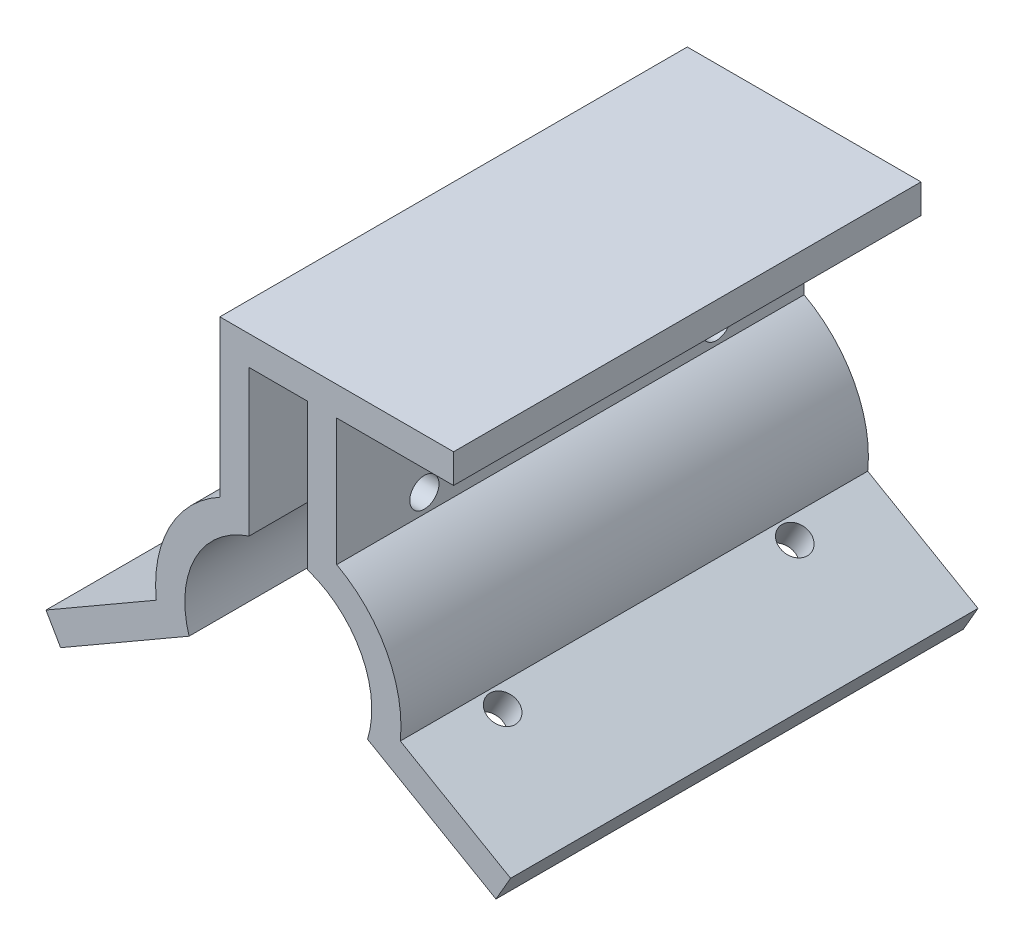
ISO-10303-21;
HEADER;
FILE_DESCRIPTION(('STEP AP214'),'2;1');
FILE_NAME('part.step','',(''),(''),'','','');
FILE_SCHEMA(('AUTOMOTIVE_DESIGN { 1 0 10303 214 1 1 1 1 }'));
ENDSEC;
DATA;
#1=APPLICATION_CONTEXT('core data for automotive mechanical design processes');
#2=APPLICATION_PROTOCOL_DEFINITION('international standard','automotive_design',2000,#1);
#3=PRODUCT_CONTEXT('',#1,'mechanical');
#4=PRODUCT('Part','Part','',(#3));
#5=PRODUCT_RELATED_PRODUCT_CATEGORY('part','',(#4));
#6=PRODUCT_DEFINITION_FORMATION('','',#4);
#7=PRODUCT_DEFINITION_CONTEXT('part definition',#1,'design');
#8=PRODUCT_DEFINITION('design','',#6,#7);
#9=PRODUCT_DEFINITION_SHAPE('','',#8);
#10=(LENGTH_UNIT() NAMED_UNIT(*) SI_UNIT(.MILLI.,.METRE.));
#11=(NAMED_UNIT(*) PLANE_ANGLE_UNIT() SI_UNIT($,.RADIAN.));
#12=(NAMED_UNIT(*) SI_UNIT($,.STERADIAN.) SOLID_ANGLE_UNIT());
#13=UNCERTAINTY_MEASURE_WITH_UNIT(LENGTH_MEASURE(1.E-05),#10,'distance_accuracy_value','');
#14=(GEOMETRIC_REPRESENTATION_CONTEXT(3) GLOBAL_UNCERTAINTY_ASSIGNED_CONTEXT((#13)) GLOBAL_UNIT_ASSIGNED_CONTEXT((#10,
#11,#12)) REPRESENTATION_CONTEXT('',''));
#15=CARTESIAN_POINT('',(0.,0.,0.));
#16=DIRECTION('',(0.,0.,1.));
#17=DIRECTION('',(1.,0.,0.));
#18=AXIS2_PLACEMENT_3D('',#15,#16,#17);
#19=CARTESIAN_POINT('',(0.,0.,80.));
#20=DIRECTION('',(0.,0.,-1.));
#21=DIRECTION('',(-1.,0.,0.));
#22=AXIS2_PLACEMENT_3D('',#19,#20,#21);
#23=CYLINDRICAL_SURFACE('',#22,16.);
#24=CARTESIAN_POINT('',(0.,0.,0.));
#25=DIRECTION('',(0.,0.,1.));
#26=DIRECTION('',(1.,0.,0.));
#27=AXIS2_PLACEMENT_3D('',#24,#25,#26);
#28=CIRCLE('',#27,16.);
#29=CARTESIAN_POINT('',(-5.,15.1986841535707,0.));
#30=VERTEX_POINT('',#29);
#31=CARTESIAN_POINT('',(-15.27081728299,-4.77515858475237,0.));
#32=VERTEX_POINT('',#31);
#33=EDGE_CURVE('E193',#30,#32,#28,.T.);
#34=ORIENTED_EDGE('',*,*,#33,.F.);
#35=DIRECTION('',(0.,0.,-1.));
#36=VECTOR('',#35,1.);
#37=CARTESIAN_POINT('',(-5.,15.1986841535707,80.));
#38=LINE('',#37,#36);
#39=CARTESIAN_POINT('',(-5.,15.1986841535707,80.));
#40=VERTEX_POINT('',#39);
#41=EDGE_CURVE('E11',#40,#30,#38,.T.);
#42=ORIENTED_EDGE('',*,*,#41,.F.);
#43=CARTESIAN_POINT('',(0.,0.,80.));
#44=DIRECTION('',(0.,0.,1.));
#45=DIRECTION('',(1.,0.,0.));
#46=AXIS2_PLACEMENT_3D('',#43,#44,#45);
#47=CIRCLE('',#46,16.);
#48=CARTESIAN_POINT('',(-15.27081728299,-4.77515858475237,80.));
#49=VERTEX_POINT('',#48);
#50=EDGE_CURVE('E241',#40,#49,#47,.T.);
#51=ORIENTED_EDGE('',*,*,#50,.T.);
#52=DIRECTION('',(0.,0.,-1.));
#53=VECTOR('',#52,1.);
#54=CARTESIAN_POINT('',(-15.27081728299,-4.77515858475237,80.));
#55=LINE('',#54,#53);
#56=EDGE_CURVE('E56',#49,#32,#55,.T.);
#57=ORIENTED_EDGE('',*,*,#56,.T.);
#58=EDGE_LOOP('',(#34,#42,#51,#57));
#59=FACE_BOUND('',#58,.T.);
#60=ADVANCED_FACE('F38',(#59),#23,.F.);
#61=CARTESIAN_POINT('',(-4.99999999999999,0.,80.));
#62=DIRECTION('',(1.,0.,0.));
#63=DIRECTION('',(0.,1.,0.));
#64=AXIS2_PLACEMENT_3D('',#61,#62,#63);
#65=PLANE('',#64);
#66=CARTESIAN_POINT('',(-5.,21.6986841535707,15.));
#67=DIRECTION('',(1.,0.,0.));
#68=DIRECTION('',(0.,0.,-1.));
#69=AXIS2_PLACEMENT_3D('',#66,#67,#68);
#70=CIRCLE('',#69,2.5);
#71=CARTESIAN_POINT('',(-5.,21.6986841535707,12.5));
#72=VERTEX_POINT('',#71);
#73=EDGE_CURVE('E275',#72,#72,#70,.T.);
#74=ORIENTED_EDGE('',*,*,#73,.F.);
#75=EDGE_LOOP('',(#74));
#76=FACE_BOUND('',#75,.T.);
#77=CARTESIAN_POINT('',(-5.,21.6986841535707,65.));
#78=DIRECTION('',(1.,0.,0.));
#79=DIRECTION('',(0.,0.,-1.));
#80=AXIS2_PLACEMENT_3D('',#77,#78,#79);
#81=CIRCLE('',#80,2.5);
#82=CARTESIAN_POINT('',(-5.,21.6986841535707,62.5));
#83=VERTEX_POINT('',#82);
#84=EDGE_CURVE('E274',#83,#83,#81,.T.);
#85=ORIENTED_EDGE('',*,*,#84,.F.);
#86=EDGE_LOOP('',(#85));
#87=FACE_BOUND('',#86,.T.);
#88=DIRECTION('',(0.,-1.,0.));
#89=VECTOR('',#88,1.);
#90=CARTESIAN_POINT('',(-4.99999999999999,0.,0.));
#91=LINE('',#90,#89);
#92=CARTESIAN_POINT('',(-5.,40.1986841535707,0.));
#93=VERTEX_POINT('',#92);
#94=EDGE_CURVE('E195',#93,#30,#91,.T.);
#95=ORIENTED_EDGE('',*,*,#94,.F.);
#96=DIRECTION('',(0.,0.,-1.));
#97=VECTOR('',#96,1.);
#98=CARTESIAN_POINT('',(-5.,40.1986841535707,80.));
#99=LINE('',#98,#97);
#100=CARTESIAN_POINT('',(-5.,40.1986841535707,80.));
#101=VERTEX_POINT('',#100);
#102=EDGE_CURVE('E47',#101,#93,#99,.T.);
#103=ORIENTED_EDGE('',*,*,#102,.F.);
#104=DIRECTION('',(0.,-1.,0.));
#105=VECTOR('',#104,1.);
#106=CARTESIAN_POINT('',(-4.99999999999999,0.,80.));
#107=LINE('',#106,#105);
#108=EDGE_CURVE('E320',#101,#40,#107,.T.);
#109=ORIENTED_EDGE('',*,*,#108,.T.);
#110=ORIENTED_EDGE('',*,*,#41,.T.);
#111=EDGE_LOOP('',(#95,#103,#109,#110));
#112=FACE_BOUND('',#111,.T.);
#113=ADVANCED_FACE('F379',(#76,#87,#112),#65,.T.);
#114=CARTESIAN_POINT('',(0.,40.1986841535707,80.));
#115=DIRECTION('',(0.,1.,0.));
#116=DIRECTION('',(0.,0.,1.));
#117=AXIS2_PLACEMENT_3D('',#114,#115,#116);
#118=PLANE('',#117);
#119=DIRECTION('',(1.,0.,0.));
#120=VECTOR('',#119,1.);
#121=CARTESIAN_POINT('',(0.,40.1986841535707,0.));
#122=LINE('',#121,#120);
#123=CARTESIAN_POINT('',(5.,40.1986841535707,0.));
#124=VERTEX_POINT('',#123);
#125=EDGE_CURVE('E199',#93,#124,#122,.T.);
#126=ORIENTED_EDGE('',*,*,#125,.T.);
#127=DIRECTION('',(0.,0.,-1.));
#128=VECTOR('',#127,1.);
#129=CARTESIAN_POINT('',(5.,40.1986841535707,80.));
#130=LINE('',#129,#128);
#131=CARTESIAN_POINT('',(5.,40.1986841535707,80.));
#132=VERTEX_POINT('',#131);
#133=EDGE_CURVE('E268',#132,#124,#130,.T.);
#134=ORIENTED_EDGE('',*,*,#133,.F.);
#135=DIRECTION('',(1.,0.,0.));
#136=VECTOR('',#135,1.);
#137=CARTESIAN_POINT('',(0.,40.1986841535707,80.));
#138=LINE('',#137,#136);
#139=EDGE_CURVE('E323',#101,#132,#138,.T.);
#140=ORIENTED_EDGE('',*,*,#139,.F.);
#141=ORIENTED_EDGE('',*,*,#102,.T.);
#142=EDGE_LOOP('',(#126,#134,#140,#141));
#143=FACE_BOUND('',#142,.T.);
#144=ADVANCED_FACE('F383',(#143),#118,.F.);
#145=CARTESIAN_POINT('',(5.00000000000001,0.,80.));
#146=DIRECTION('',(1.,0.,0.));
#147=DIRECTION('',(0.,1.,0.));
#148=AXIS2_PLACEMENT_3D('',#145,#146,#147);
#149=PLANE('',#148);
#150=CARTESIAN_POINT('',(5.,21.6986841535707,15.));
#151=DIRECTION('',(-1.,0.,0.));
#152=DIRECTION('',(0.,0.,1.));
#153=AXIS2_PLACEMENT_3D('',#150,#151,#152);
#154=CIRCLE('',#153,2.5);
#155=CARTESIAN_POINT('',(5.,21.6986841535707,17.5));
#156=VERTEX_POINT('',#155);
#157=EDGE_CURVE('E288',#156,#156,#154,.T.);
#158=ORIENTED_EDGE('',*,*,#157,.F.);
#159=EDGE_LOOP('',(#158));
#160=FACE_BOUND('',#159,.T.);
#161=CARTESIAN_POINT('',(5.,21.6986841535707,65.));
#162=DIRECTION('',(-1.,0.,0.));
#163=DIRECTION('',(0.,0.,1.));
#164=AXIS2_PLACEMENT_3D('',#161,#162,#163);
#165=CIRCLE('',#164,2.5);
#166=CARTESIAN_POINT('',(5.,21.6986841535707,67.5));
#167=VERTEX_POINT('',#166);
#168=EDGE_CURVE('E278',#167,#167,#165,.T.);
#169=ORIENTED_EDGE('',*,*,#168,.F.);
#170=EDGE_LOOP('',(#169));
#171=FACE_BOUND('',#170,.T.);
#172=DIRECTION('',(0.,-1.,0.));
#173=VECTOR('',#172,1.);
#174=CARTESIAN_POINT('',(5.00000000000001,0.,0.));
#175=LINE('',#174,#173);
#176=CARTESIAN_POINT('',(5.,15.1986841535707,0.));
#177=VERTEX_POINT('',#176);
#178=EDGE_CURVE('E201',#124,#177,#175,.T.);
#179=ORIENTED_EDGE('',*,*,#178,.T.);
#180=DIRECTION('',(0.,0.,-1.));
#181=VECTOR('',#180,1.);
#182=CARTESIAN_POINT('',(5.,15.1986841535707,80.));
#183=LINE('',#182,#181);
#184=CARTESIAN_POINT('',(5.,15.1986841535707,80.));
#185=VERTEX_POINT('',#184);
#186=EDGE_CURVE('E266',#185,#177,#183,.T.);
#187=ORIENTED_EDGE('',*,*,#186,.F.);
#188=DIRECTION('',(0.,-1.,0.));
#189=VECTOR('',#188,1.);
#190=CARTESIAN_POINT('',(5.00000000000001,0.,80.));
#191=LINE('',#190,#189);
#192=EDGE_CURVE('E325',#132,#185,#191,.T.);
#193=ORIENTED_EDGE('',*,*,#192,.F.);
#194=ORIENTED_EDGE('',*,*,#133,.T.);
#195=EDGE_LOOP('',(#179,#187,#193,#194));
#196=FACE_BOUND('',#195,.T.);
#197=ADVANCED_FACE('F397',(#160,#171,#196),#149,.F.);
#198=CARTESIAN_POINT('',(0.,0.,80.));
#199=DIRECTION('',(0.,0.,-1.));
#200=DIRECTION('',(-1.,0.,0.));
#201=AXIS2_PLACEMENT_3D('',#198,#199,#200);
#202=CYLINDRICAL_SURFACE('',#201,16.);
#203=CARTESIAN_POINT('',(0.,0.,0.));
#204=DIRECTION('',(0.,0.,1.));
#205=DIRECTION('',(1.,0.,0.));
#206=AXIS2_PLACEMENT_3D('',#203,#204,#205);
#207=CIRCLE('',#206,16.);
#208=CARTESIAN_POINT('',(15.27081728299,-4.77515858475248,0.));
#209=VERTEX_POINT('',#208);
#210=EDGE_CURVE('E204',#209,#177,#207,.T.);
#211=ORIENTED_EDGE('',*,*,#210,.F.);
#212=DIRECTION('',(0.,0.,-1.));
#213=VECTOR('',#212,1.);
#214=CARTESIAN_POINT('',(15.27081728299,-4.77515858475248,80.));
#215=LINE('',#214,#213);
#216=CARTESIAN_POINT('',(15.27081728299,-4.77515858475248,80.));
#217=VERTEX_POINT('',#216);
#218=EDGE_CURVE('E264',#217,#209,#215,.T.);
#219=ORIENTED_EDGE('',*,*,#218,.F.);
#220=CARTESIAN_POINT('',(0.,0.,80.));
#221=DIRECTION('',(0.,0.,1.));
#222=DIRECTION('',(1.,0.,0.));
#223=AXIS2_PLACEMENT_3D('',#220,#221,#222);
#224=CIRCLE('',#223,16.);
#225=EDGE_CURVE('E327',#217,#185,#224,.T.);
#226=ORIENTED_EDGE('',*,*,#225,.T.);
#227=ORIENTED_EDGE('',*,*,#186,.T.);
#228=EDGE_LOOP('',(#211,#219,#226,#227));
#229=FACE_BOUND('',#228,.T.);
#230=ADVANCED_FACE('F400',(#229),#202,.F.);
#231=CARTESIAN_POINT('',(1.75000000000001,3.03108891324554,80.));
#232=DIRECTION('',(0.500000000000001,0.866025403784438,0.));
#233=DIRECTION('',(-0.866025403784438,0.500000000000001,0.));
#234=AXIS2_PLACEMENT_3D('',#231,#232,#233);
#235=PLANE('',#234);
#236=CARTESIAN_POINT('',(20.8999824075888,-8.02515858475249,65.));
#237=DIRECTION('',(-0.500000000000001,-0.866025403784438,0.));
#238=DIRECTION('',(0.866025403784438,-0.500000000000001,0.));
#239=AXIS2_PLACEMENT_3D('',#236,#237,#238);
#240=CIRCLE('',#239,2.49999999999999);
#241=CARTESIAN_POINT('',(23.0650459170499,-9.27515858475248,65.));
#242=VERTEX_POINT('',#241);
#243=EDGE_CURVE('E308',#242,#242,#240,.T.);
#244=ORIENTED_EDGE('',*,*,#243,.F.);
#245=EDGE_LOOP('',(#244));
#246=FACE_BOUND('',#245,.T.);
#247=CARTESIAN_POINT('',(20.8999824075888,-8.02515858475249,15.));
#248=DIRECTION('',(-0.500000000000001,-0.866025403784438,0.));
#249=DIRECTION('',(0.866025403784438,-0.500000000000001,0.));
#250=AXIS2_PLACEMENT_3D('',#247,#248,#249);
#251=CIRCLE('',#250,2.49999999999999);
#252=CARTESIAN_POINT('',(23.0650459170499,-9.27515858475248,15.));
#253=VERTEX_POINT('',#252);
#254=EDGE_CURVE('E314',#253,#253,#251,.T.);
#255=ORIENTED_EDGE('',*,*,#254,.F.);
#256=EDGE_LOOP('',(#255));
#257=FACE_BOUND('',#256,.T.);
#258=DIRECTION('',(0.866025403784438,-0.500000000000001,0.));
#259=VECTOR('',#258,1.);
#260=CARTESIAN_POINT('',(1.75000000000001,3.03108891324554,0.));
#261=LINE('',#260,#259);
#262=CARTESIAN_POINT('',(37.257041555162,-17.4689110867545,0.));
#263=VERTEX_POINT('',#262);
#264=EDGE_CURVE('E207',#209,#263,#261,.T.);
#265=ORIENTED_EDGE('',*,*,#264,.T.);
#266=DIRECTION('',(0.,0.,-1.));
#267=VECTOR('',#266,1.);
#268=CARTESIAN_POINT('',(37.257041555162,-17.4689110867545,80.));
#269=LINE('',#268,#267);
#270=CARTESIAN_POINT('',(37.257041555162,-17.4689110867545,80.));
#271=VERTEX_POINT('',#270);
#272=EDGE_CURVE('E262',#271,#263,#269,.T.);
#273=ORIENTED_EDGE('',*,*,#272,.F.);
#274=DIRECTION('',(0.866025403784438,-0.500000000000001,0.));
#275=VECTOR('',#274,1.);
#276=CARTESIAN_POINT('',(1.75000000000001,3.03108891324554,80.));
#277=LINE('',#276,#275);
#278=EDGE_CURVE('E330',#217,#271,#277,.T.);
#279=ORIENTED_EDGE('',*,*,#278,.F.);
#280=ORIENTED_EDGE('',*,*,#218,.T.);
#281=EDGE_LOOP('',(#265,#273,#279,#280));
#282=FACE_BOUND('',#281,.T.);
#283=ADVANCED_FACE('F406',(#246,#257,#282),#235,.F.);
#284=CARTESIAN_POINT('',(35.507041555162,-20.5,80.));
#285=DIRECTION('',(0.866025403784438,-0.5,0.));
#286=DIRECTION('',(0.5,0.866025403784438,0.));
#287=AXIS2_PLACEMENT_3D('',#284,#285,#286);
#288=PLANE('',#287);
#289=DIRECTION('',(-0.5,-0.866025403784438,0.));
#290=VECTOR('',#289,1.);
#291=CARTESIAN_POINT('',(35.507041555162,-20.5,0.));
#292=LINE('',#291,#290);
#293=CARTESIAN_POINT('',(39.757041555162,-13.1387840678323,0.));
#294=VERTEX_POINT('',#293);
#295=EDGE_CURVE('E210',#294,#263,#292,.T.);
#296=ORIENTED_EDGE('',*,*,#295,.F.);
#297=DIRECTION('',(0.,0.,-1.));
#298=VECTOR('',#297,1.);
#299=CARTESIAN_POINT('',(39.757041555162,-13.1387840678323,80.));
#300=LINE('',#299,#298);
#301=CARTESIAN_POINT('',(39.757041555162,-13.1387840678323,80.));
#302=VERTEX_POINT('',#301);
#303=EDGE_CURVE('E260',#302,#294,#300,.T.);
#304=ORIENTED_EDGE('',*,*,#303,.F.);
#305=DIRECTION('',(-0.5,-0.866025403784438,0.));
#306=VECTOR('',#305,1.);
#307=CARTESIAN_POINT('',(35.507041555162,-20.5,80.));
#308=LINE('',#307,#306);
#309=EDGE_CURVE('E332',#302,#271,#308,.T.);
#310=ORIENTED_EDGE('',*,*,#309,.T.);
#311=ORIENTED_EDGE('',*,*,#272,.T.);
#312=EDGE_LOOP('',(#296,#304,#310,#311));
#313=FACE_BOUND('',#312,.T.);
#314=ADVANCED_FACE('F410',(#313),#288,.T.);
#315=CARTESIAN_POINT('',(4.25000000000001,7.36121593216772,80.));
#316=DIRECTION('',(0.500000000000001,0.866025403784438,0.));
#317=DIRECTION('',(-0.866025403784438,0.500000000000001,0.));
#318=AXIS2_PLACEMENT_3D('',#315,#316,#317);
#319=PLANE('',#318);
#320=CARTESIAN_POINT('',(23.3999824075888,-3.6950315658303,65.));
#321=DIRECTION('',(0.500000000000001,0.866025403784438,0.));
#322=DIRECTION('',(-0.866025403784438,0.500000000000001,0.));
#323=AXIS2_PLACEMENT_3D('',#320,#321,#322);
#324=CIRCLE('',#323,2.49999999999999);
#325=CARTESIAN_POINT('',(21.2349188981277,-2.4450315658303,65.));
#326=VERTEX_POINT('',#325);
#327=EDGE_CURVE('E311',#326,#326,#324,.T.);
#328=ORIENTED_EDGE('',*,*,#327,.F.);
#329=EDGE_LOOP('',(#328));
#330=FACE_BOUND('',#329,.T.);
#331=CARTESIAN_POINT('',(23.3999824075888,-3.6950315658303,15.));
#332=DIRECTION('',(0.500000000000001,0.866025403784438,0.));
#333=DIRECTION('',(-0.866025403784438,0.500000000000001,0.));
#334=AXIS2_PLACEMENT_3D('',#331,#332,#333);
#335=CIRCLE('',#334,2.49999999999999);
#336=CARTESIAN_POINT('',(21.2349188981277,-2.4450315658303,15.));
#337=VERTEX_POINT('',#336);
#338=EDGE_CURVE('E196',#337,#337,#335,.T.);
#339=ORIENTED_EDGE('',*,*,#338,.F.);
#340=EDGE_LOOP('',(#339));
#341=FACE_BOUND('',#340,.T.);
#342=DIRECTION('',(0.866025403784438,-0.500000000000001,0.));
#343=VECTOR('',#342,1.);
#344=CARTESIAN_POINT('',(4.25000000000001,7.36121593216772,0.));
#345=LINE('',#344,#343);
#346=CARTESIAN_POINT('',(20.8801683695626,-2.24021625266806,0.));
#347=VERTEX_POINT('',#346);
#348=EDGE_CURVE('E213',#347,#294,#345,.T.);
#349=ORIENTED_EDGE('',*,*,#348,.F.);
#350=DIRECTION('',(0.,0.,-1.));
#351=VECTOR('',#350,1.);
#352=CARTESIAN_POINT('',(20.8801683695626,-2.24021625266806,80.));
#353=LINE('',#352,#351);
#354=CARTESIAN_POINT('',(20.8801683695626,-2.24021625266806,80.));
#355=VERTEX_POINT('',#354);
#356=EDGE_CURVE('E258',#355,#347,#353,.T.);
#357=ORIENTED_EDGE('',*,*,#356,.F.);
#358=DIRECTION('',(0.866025403784438,-0.500000000000001,0.));
#359=VECTOR('',#358,1.);
#360=CARTESIAN_POINT('',(4.25000000000001,7.36121593216772,80.));
#361=LINE('',#360,#359);
#362=EDGE_CURVE('E335',#355,#302,#361,.T.);
#363=ORIENTED_EDGE('',*,*,#362,.T.);
#364=ORIENTED_EDGE('',*,*,#303,.T.);
#365=EDGE_LOOP('',(#349,#357,#363,#364));
#366=FACE_BOUND('',#365,.T.);
#367=ADVANCED_FACE('F413',(#330,#341,#366),#319,.T.);
#368=CARTESIAN_POINT('',(0.,0.,80.));
#369=DIRECTION('',(0.,0.,-1.));
#370=DIRECTION('',(-1.,0.,0.));
#371=AXIS2_PLACEMENT_3D('',#368,#369,#370);
#372=CYLINDRICAL_SURFACE('',#371,21.);
#373=CARTESIAN_POINT('',(0.,0.,0.));
#374=DIRECTION('',(0.,0.,1.));
#375=DIRECTION('',(1.,0.,0.));
#376=AXIS2_PLACEMENT_3D('',#373,#374,#375);
#377=CIRCLE('',#376,21.);
#378=CARTESIAN_POINT('',(10.,18.4661853126194,0.));
#379=VERTEX_POINT('',#378);
#380=EDGE_CURVE('E216',#347,#379,#377,.T.);
#381=ORIENTED_EDGE('',*,*,#380,.T.);
#382=DIRECTION('',(0.,0.,-1.));
#383=VECTOR('',#382,1.);
#384=CARTESIAN_POINT('',(10.,18.4661853126194,80.));
#385=LINE('',#384,#383);
#386=CARTESIAN_POINT('',(10.,18.4661853126194,80.));
#387=VERTEX_POINT('',#386);
#388=EDGE_CURVE('E256',#387,#379,#385,.T.);
#389=ORIENTED_EDGE('',*,*,#388,.F.);
#390=CARTESIAN_POINT('',(0.,0.,80.));
#391=DIRECTION('',(0.,0.,1.));
#392=DIRECTION('',(1.,0.,0.));
#393=AXIS2_PLACEMENT_3D('',#390,#391,#392);
#394=CIRCLE('',#393,21.);
#395=EDGE_CURVE('E338',#355,#387,#394,.T.);
#396=ORIENTED_EDGE('',*,*,#395,.F.);
#397=ORIENTED_EDGE('',*,*,#356,.T.);
#398=EDGE_LOOP('',(#381,#389,#396,#397));
#399=FACE_BOUND('',#398,.T.);
#400=ADVANCED_FACE('F419',(#399),#372,.T.);
#401=CARTESIAN_POINT('',(10.,0.,80.));
#402=DIRECTION('',(1.,0.,0.));
#403=DIRECTION('',(0.,1.,0.));
#404=AXIS2_PLACEMENT_3D('',#401,#402,#403);
#405=PLANE('',#404);
#406=CARTESIAN_POINT('',(10.,21.6986841535707,15.));
#407=DIRECTION('',(1.,0.,0.));
#408=DIRECTION('',(0.,1.,0.));
#409=AXIS2_PLACEMENT_3D('',#406,#407,#408);
#410=CIRCLE('',#409,2.49999999999999);
#411=CARTESIAN_POINT('',(10.,24.1986841535707,15.));
#412=VERTEX_POINT('',#411);
#413=EDGE_CURVE('E41',#412,#412,#410,.T.);
#414=ORIENTED_EDGE('',*,*,#413,.F.);
#415=EDGE_LOOP('',(#414));
#416=FACE_BOUND('',#415,.T.);
#417=CARTESIAN_POINT('',(10.,21.6986841535707,65.));
#418=DIRECTION('',(1.,0.,0.));
#419=DIRECTION('',(0.,1.,0.));
#420=AXIS2_PLACEMENT_3D('',#417,#418,#419);
#421=CIRCLE('',#420,2.49999999999999);
#422=CARTESIAN_POINT('',(10.,24.1986841535707,65.));
#423=VERTEX_POINT('',#422);
#424=EDGE_CURVE('E276',#423,#423,#421,.T.);
#425=ORIENTED_EDGE('',*,*,#424,.F.);
#426=EDGE_LOOP('',(#425));
#427=FACE_BOUND('',#426,.T.);
#428=DIRECTION('',(0.,-1.,0.));
#429=VECTOR('',#428,1.);
#430=CARTESIAN_POINT('',(10.,0.,0.));
#431=LINE('',#430,#429);
#432=CARTESIAN_POINT('',(10.,40.1986841535707,0.));
#433=VERTEX_POINT('',#432);
#434=EDGE_CURVE('E219',#433,#379,#431,.T.);
#435=ORIENTED_EDGE('',*,*,#434,.F.);
#436=DIRECTION('',(0.,0.,-1.));
#437=VECTOR('',#436,1.);
#438=CARTESIAN_POINT('',(10.,40.1986841535707,80.));
#439=LINE('',#438,#437);
#440=CARTESIAN_POINT('',(10.,40.1986841535707,80.));
#441=VERTEX_POINT('',#440);
#442=EDGE_CURVE('E254',#441,#433,#439,.T.);
#443=ORIENTED_EDGE('',*,*,#442,.F.);
#444=DIRECTION('',(0.,-1.,0.));
#445=VECTOR('',#444,1.);
#446=CARTESIAN_POINT('',(10.,0.,80.));
#447=LINE('',#446,#445);
#448=EDGE_CURVE('E340',#441,#387,#447,.T.);
#449=ORIENTED_EDGE('',*,*,#448,.T.);
#450=ORIENTED_EDGE('',*,*,#388,.T.);
#451=EDGE_LOOP('',(#435,#443,#449,#450));
#452=FACE_BOUND('',#451,.T.);
#453=ADVANCED_FACE('F423',(#416,#427,#452),#405,.T.);
#454=CARTESIAN_POINT('',(0.,40.1986841535707,80.));
#455=DIRECTION('',(0.,-1.,0.));
#456=DIRECTION('',(1.,0.,0.));
#457=AXIS2_PLACEMENT_3D('',#454,#455,#456);
#458=PLANE('',#457);
#459=DIRECTION('',(-1.,0.,0.));
#460=VECTOR('',#459,1.);
#461=CARTESIAN_POINT('',(0.,40.1986841535707,0.));
#462=LINE('',#461,#460);
#463=CARTESIAN_POINT('',(30.,40.1986841535707,0.));
#464=VERTEX_POINT('',#463);
#465=EDGE_CURVE('E222',#464,#433,#462,.T.);
#466=ORIENTED_EDGE('',*,*,#465,.F.);
#467=DIRECTION('',(0.,0.,-1.));
#468=VECTOR('',#467,1.);
#469=CARTESIAN_POINT('',(30.,40.1986841535707,80.));
#470=LINE('',#469,#468);
#471=CARTESIAN_POINT('',(30.,40.1986841535707,80.));
#472=VERTEX_POINT('',#471);
#473=EDGE_CURVE('E252',#472,#464,#470,.T.);
#474=ORIENTED_EDGE('',*,*,#473,.F.);
#475=DIRECTION('',(-1.,0.,0.));
#476=VECTOR('',#475,1.);
#477=CARTESIAN_POINT('',(0.,40.1986841535707,80.));
#478=LINE('',#477,#476);
#479=EDGE_CURVE('E343',#472,#441,#478,.T.);
#480=ORIENTED_EDGE('',*,*,#479,.T.);
#481=ORIENTED_EDGE('',*,*,#442,.T.);
#482=EDGE_LOOP('',(#466,#474,#480,#481));
#483=FACE_BOUND('',#482,.T.);
#484=ADVANCED_FACE('F426',(#483),#458,.T.);
#485=CARTESIAN_POINT('',(30.,0.,80.));
#486=DIRECTION('',(1.,0.,0.));
#487=DIRECTION('',(0.,0.,-1.));
#488=AXIS2_PLACEMENT_3D('',#485,#486,#487);
#489=PLANE('',#488);
#490=DIRECTION('',(0.,-1.,0.));
#491=VECTOR('',#490,1.);
#492=CARTESIAN_POINT('',(30.,0.,0.));
#493=LINE('',#492,#491);
#494=CARTESIAN_POINT('',(30.,45.1986841535707,0.));
#495=VERTEX_POINT('',#494);
#496=EDGE_CURVE('E225',#495,#464,#493,.T.);
#497=ORIENTED_EDGE('',*,*,#496,.F.);
#498=DIRECTION('',(0.,0.,-1.));
#499=VECTOR('',#498,1.);
#500=CARTESIAN_POINT('',(30.,45.1986841535707,80.));
#501=LINE('',#500,#499);
#502=CARTESIAN_POINT('',(30.,45.1986841535707,80.));
#503=VERTEX_POINT('',#502);
#504=EDGE_CURVE('E250',#503,#495,#501,.T.);
#505=ORIENTED_EDGE('',*,*,#504,.F.);
#506=DIRECTION('',(0.,-1.,0.));
#507=VECTOR('',#506,1.);
#508=CARTESIAN_POINT('',(30.,0.,80.));
#509=LINE('',#508,#507);
#510=EDGE_CURVE('E346',#503,#472,#509,.T.);
#511=ORIENTED_EDGE('',*,*,#510,.T.);
#512=ORIENTED_EDGE('',*,*,#473,.T.);
#513=EDGE_LOOP('',(#497,#505,#511,#512));
#514=FACE_BOUND('',#513,.T.);
#515=ADVANCED_FACE('F429',(#514),#489,.T.);
#516=CARTESIAN_POINT('',(0.,45.1986841535707,80.));
#517=DIRECTION('',(0.,1.,0.));
#518=DIRECTION('',(0.,0.,1.));
#519=AXIS2_PLACEMENT_3D('',#516,#517,#518);
#520=PLANE('',#519);
#521=DIRECTION('',(1.,0.,0.));
#522=VECTOR('',#521,1.);
#523=CARTESIAN_POINT('',(0.,45.1986841535707,0.));
#524=LINE('',#523,#522);
#525=CARTESIAN_POINT('',(-10.,45.1986841535707,0.));
#526=VERTEX_POINT('',#525);
#527=EDGE_CURVE('E228',#526,#495,#524,.T.);
#528=ORIENTED_EDGE('',*,*,#527,.F.);
#529=DIRECTION('',(0.,0.,-1.));
#530=VECTOR('',#529,1.);
#531=CARTESIAN_POINT('',(-10.,45.1986841535707,80.));
#532=LINE('',#531,#530);
#533=CARTESIAN_POINT('',(-10.,45.1986841535707,80.));
#534=VERTEX_POINT('',#533);
#535=EDGE_CURVE('E248',#534,#526,#532,.T.);
#536=ORIENTED_EDGE('',*,*,#535,.F.);
#537=DIRECTION('',(1.,0.,0.));
#538=VECTOR('',#537,1.);
#539=CARTESIAN_POINT('',(0.,45.1986841535707,80.));
#540=LINE('',#539,#538);
#541=EDGE_CURVE('E349',#534,#503,#540,.T.);
#542=ORIENTED_EDGE('',*,*,#541,.T.);
#543=ORIENTED_EDGE('',*,*,#504,.T.);
#544=EDGE_LOOP('',(#528,#536,#542,#543));
#545=FACE_BOUND('',#544,.T.);
#546=ADVANCED_FACE('F432',(#545),#520,.T.);
#547=CARTESIAN_POINT('',(-9.99999999999997,0.,80.));
#548=DIRECTION('',(1.,0.,0.));
#549=DIRECTION('',(0.,1.,0.));
#550=AXIS2_PLACEMENT_3D('',#547,#548,#549);
#551=PLANE('',#550);
#552=CARTESIAN_POINT('',(-9.99999999999998,21.6986841535707,15.));
#553=DIRECTION('',(1.,0.,0.));
#554=DIRECTION('',(0.,1.,0.));
#555=AXIS2_PLACEMENT_3D('',#552,#553,#554);
#556=CIRCLE('',#555,2.49999999999999);
#557=CARTESIAN_POINT('',(-9.99999999999999,24.1986841535707,15.));
#558=VERTEX_POINT('',#557);
#559=EDGE_CURVE('E272',#558,#558,#556,.T.);
#560=ORIENTED_EDGE('',*,*,#559,.T.);
#561=EDGE_LOOP('',(#560));
#562=FACE_BOUND('',#561,.T.);
#563=CARTESIAN_POINT('',(-9.99999999999998,21.6986841535707,65.));
#564=DIRECTION('',(1.,0.,0.));
#565=DIRECTION('',(0.,1.,0.));
#566=AXIS2_PLACEMENT_3D('',#563,#564,#565);
#567=CIRCLE('',#566,2.49999999999999);
#568=CARTESIAN_POINT('',(-9.99999999999999,24.1986841535707,65.));
#569=VERTEX_POINT('',#568);
#570=EDGE_CURVE('E293',#569,#569,#567,.T.);
#571=ORIENTED_EDGE('',*,*,#570,.T.);
#572=EDGE_LOOP('',(#571));
#573=FACE_BOUND('',#572,.T.);
#574=DIRECTION('',(0.,-1.,0.));
#575=VECTOR('',#574,1.);
#576=CARTESIAN_POINT('',(-9.99999999999997,0.,0.));
#577=LINE('',#576,#575);
#578=CARTESIAN_POINT('',(-10.,18.4661853126194,0.));
#579=VERTEX_POINT('',#578);
#580=EDGE_CURVE('E231',#526,#579,#577,.T.);
#581=ORIENTED_EDGE('',*,*,#580,.T.);
#582=DIRECTION('',(0.,0.,-1.));
#583=VECTOR('',#582,1.);
#584=CARTESIAN_POINT('',(-10.,18.4661853126194,80.));
#585=LINE('',#584,#583);
#586=CARTESIAN_POINT('',(-10.,18.4661853126194,80.));
#587=VERTEX_POINT('',#586);
#588=EDGE_CURVE('E245',#587,#579,#585,.T.);
#589=ORIENTED_EDGE('',*,*,#588,.F.);
#590=DIRECTION('',(0.,-1.,0.));
#591=VECTOR('',#590,1.);
#592=CARTESIAN_POINT('',(-9.99999999999997,0.,80.));
#593=LINE('',#592,#591);
#594=EDGE_CURVE('E352',#534,#587,#593,.T.);
#595=ORIENTED_EDGE('',*,*,#594,.F.);
#596=ORIENTED_EDGE('',*,*,#535,.T.);
#597=EDGE_LOOP('',(#581,#589,#595,#596));
#598=FACE_BOUND('',#597,.T.);
#599=ADVANCED_FACE('F358',(#562,#573,#598),#551,.F.);
#600=CARTESIAN_POINT('',(0.,0.,80.));
#601=DIRECTION('',(0.,0.,-1.));
#602=DIRECTION('',(-1.,0.,0.));
#603=AXIS2_PLACEMENT_3D('',#600,#601,#602);
#604=CYLINDRICAL_SURFACE('',#603,21.);
#605=CARTESIAN_POINT('',(0.,0.,0.));
#606=DIRECTION('',(0.,0.,1.));
#607=DIRECTION('',(1.,0.,0.));
#608=AXIS2_PLACEMENT_3D('',#605,#606,#607);
#609=CIRCLE('',#608,21.);
#610=CARTESIAN_POINT('',(-20.8801683695626,-2.24021625266791,0.));
#611=VERTEX_POINT('',#610);
#612=EDGE_CURVE('E233',#579,#611,#609,.T.);
#613=ORIENTED_EDGE('',*,*,#612,.T.);
#614=DIRECTION('',(0.,0.,-1.));
#615=VECTOR('',#614,1.);
#616=CARTESIAN_POINT('',(-20.8801683695626,-2.24021625266791,80.));
#617=LINE('',#616,#615);
#618=CARTESIAN_POINT('',(-20.8801683695626,-2.24021625266791,80.));
#619=VERTEX_POINT('',#618);
#620=EDGE_CURVE('E185',#619,#611,#617,.T.);
#621=ORIENTED_EDGE('',*,*,#620,.F.);
#622=CARTESIAN_POINT('',(0.,0.,80.));
#623=DIRECTION('',(0.,0.,1.));
#624=DIRECTION('',(1.,0.,0.));
#625=AXIS2_PLACEMENT_3D('',#622,#623,#624);
#626=CIRCLE('',#625,21.);
#627=EDGE_CURVE('E173',#587,#619,#626,.T.);
#628=ORIENTED_EDGE('',*,*,#627,.F.);
#629=ORIENTED_EDGE('',*,*,#588,.T.);
#630=EDGE_LOOP('',(#613,#621,#628,#629));
#631=FACE_BOUND('',#630,.T.);
#632=ADVANCED_FACE('F362',(#631),#604,.T.);
#633=CARTESIAN_POINT('',(-4.24999999999996,7.36121593216775,80.));
#634=DIRECTION('',(0.499999999999995,-0.866025403784442,0.));
#635=DIRECTION('',(0.866025403784442,0.499999999999995,0.));
#636=AXIS2_PLACEMENT_3D('',#633,#634,#635);
#637=PLANE('',#636);
#638=CARTESIAN_POINT('',(-23.3999824075889,-3.69503156583016,65.));
#639=DIRECTION('',(0.499999999999995,-0.866025403784442,0.));
#640=DIRECTION('',(0.866025403784442,0.499999999999995,0.));
#641=AXIS2_PLACEMENT_3D('',#638,#639,#640);
#642=CIRCLE('',#641,2.49999999999999);
#643=CARTESIAN_POINT('',(-21.2349188981278,-2.44503156583018,65.));
#644=VERTEX_POINT('',#643);
#645=EDGE_CURVE('E299',#644,#644,#642,.T.);
#646=ORIENTED_EDGE('',*,*,#645,.T.);
#647=EDGE_LOOP('',(#646));
#648=FACE_BOUND('',#647,.T.);
#649=CARTESIAN_POINT('',(-23.3999824075889,-3.69503156583016,15.));
#650=DIRECTION('',(0.499999999999995,-0.866025403784442,0.));
#651=DIRECTION('',(0.866025403784442,0.499999999999995,0.));
#652=AXIS2_PLACEMENT_3D('',#649,#650,#651);
#653=CIRCLE('',#652,2.49999999999999);
#654=CARTESIAN_POINT('',(-21.2349188981278,-2.44503156583018,15.));
#655=VERTEX_POINT('',#654);
#656=EDGE_CURVE('E305',#655,#655,#653,.T.);
#657=ORIENTED_EDGE('',*,*,#656,.T.);
#658=EDGE_LOOP('',(#657));
#659=FACE_BOUND('',#658,.T.);
#660=DIRECTION('',(-0.866025403784442,-0.499999999999995,0.));
#661=VECTOR('',#660,1.);
#662=CARTESIAN_POINT('',(-4.24999999999996,7.36121593216775,0.));
#663=LINE('',#662,#661);
#664=CARTESIAN_POINT('',(-39.7570415551621,-13.138784067832,0.));
#665=VERTEX_POINT('',#664);
#666=EDGE_CURVE('E182',#611,#665,#663,.T.);
#667=ORIENTED_EDGE('',*,*,#666,.T.);
#668=DIRECTION('',(0.,0.,-1.));
#669=VECTOR('',#668,1.);
#670=CARTESIAN_POINT('',(-39.7570415551621,-13.138784067832,80.));
#671=LINE('',#670,#669);
#672=CARTESIAN_POINT('',(-39.7570415551621,-13.138784067832,80.));
#673=VERTEX_POINT('',#672);
#674=EDGE_CURVE('E179',#673,#665,#671,.T.);
#675=ORIENTED_EDGE('',*,*,#674,.F.);
#676=DIRECTION('',(-0.866025403784442,-0.499999999999995,0.));
#677=VECTOR('',#676,1.);
#678=CARTESIAN_POINT('',(-4.24999999999996,7.36121593216775,80.));
#679=LINE('',#678,#677);
#680=EDGE_CURVE('E166',#619,#673,#679,.T.);
#681=ORIENTED_EDGE('',*,*,#680,.F.);
#682=ORIENTED_EDGE('',*,*,#620,.T.);
#683=EDGE_LOOP('',(#667,#675,#681,#682));
#684=FACE_BOUND('',#683,.T.);
#685=ADVANCED_FACE('F180',(#648,#659,#684),#637,.F.);
#686=CARTESIAN_POINT('',(-35.5070415551621,-20.4999999999999,80.));
#687=DIRECTION('',(0.86602540378444,0.499999999999997,0.));
#688=DIRECTION('',(-0.499999999999997,0.86602540378444,0.));
#689=AXIS2_PLACEMENT_3D('',#686,#687,#688);
#690=PLANE('',#689);
#691=DIRECTION('',(0.499999999999997,-0.86602540378444,0.));
#692=VECTOR('',#691,1.);
#693=CARTESIAN_POINT('',(-35.5070415551621,-20.4999999999999,0.));
#694=LINE('',#693,#692);
#695=CARTESIAN_POINT('',(-37.2570415551621,-17.4689110867543,0.));
#696=VERTEX_POINT('',#695);
#697=EDGE_CURVE('E236',#665,#696,#694,.T.);
#698=ORIENTED_EDGE('',*,*,#697,.T.);
#699=DIRECTION('',(0.,0.,-1.));
#700=VECTOR('',#699,1.);
#701=CARTESIAN_POINT('',(-37.2570415551621,-17.4689110867543,80.));
#702=LINE('',#701,#700);
#703=CARTESIAN_POINT('',(-37.2570415551621,-17.4689110867543,80.));
#704=VERTEX_POINT('',#703);
#705=EDGE_CURVE('E112',#704,#696,#702,.T.);
#706=ORIENTED_EDGE('',*,*,#705,.F.);
#707=DIRECTION('',(0.499999999999997,-0.86602540378444,0.));
#708=VECTOR('',#707,1.);
#709=CARTESIAN_POINT('',(-35.5070415551621,-20.4999999999999,80.));
#710=LINE('',#709,#708);
#711=EDGE_CURVE('E171',#673,#704,#710,.T.);
#712=ORIENTED_EDGE('',*,*,#711,.F.);
#713=ORIENTED_EDGE('',*,*,#674,.T.);
#714=EDGE_LOOP('',(#698,#706,#712,#713));
#715=FACE_BOUND('',#714,.T.);
#716=ADVANCED_FACE('F187',(#715),#690,.F.);
#717=CARTESIAN_POINT('',(-1.74999999999999,3.03108891324555,80.));
#718=DIRECTION('',(0.499999999999995,-0.866025403784442,0.));
#719=DIRECTION('',(0.866025403784442,0.499999999999995,0.));
#720=AXIS2_PLACEMENT_3D('',#717,#718,#719);
#721=PLANE('',#720);
#722=CARTESIAN_POINT('',(-20.8999824075888,-8.02515858475249,65.));
#723=DIRECTION('',(0.500000000000001,-0.866025403784438,0.));
#724=DIRECTION('',(0.866025403784438,0.500000000000001,0.));
#725=AXIS2_PLACEMENT_3D('',#722,#723,#724);
#726=CIRCLE('',#725,2.49999999999999);
#727=CARTESIAN_POINT('',(-18.7349188981277,-6.77515858475249,65.));
#728=VERTEX_POINT('',#727);
#729=EDGE_CURVE('E296',#728,#728,#726,.T.);
#730=ORIENTED_EDGE('',*,*,#729,.F.);
#731=EDGE_LOOP('',(#730));
#732=FACE_BOUND('',#731,.T.);
#733=CARTESIAN_POINT('',(-20.8999824075888,-8.02515858475249,15.));
#734=DIRECTION('',(0.500000000000001,-0.866025403784438,0.));
#735=DIRECTION('',(0.866025403784438,0.500000000000001,0.));
#736=AXIS2_PLACEMENT_3D('',#733,#734,#735);
#737=CIRCLE('',#736,2.49999999999999);
#738=CARTESIAN_POINT('',(-18.7349188981277,-6.77515858475249,15.));
#739=VERTEX_POINT('',#738);
#740=EDGE_CURVE('E302',#739,#739,#737,.T.);
#741=ORIENTED_EDGE('',*,*,#740,.F.);
#742=EDGE_LOOP('',(#741));
#743=FACE_BOUND('',#742,.T.);
#744=DIRECTION('',(-0.866025403784442,-0.499999999999995,0.));
#745=VECTOR('',#744,1.);
#746=CARTESIAN_POINT('',(-1.74999999999999,3.03108891324555,0.));
#747=LINE('',#746,#745);
#748=EDGE_CURVE('E238',#32,#696,#747,.T.);
#749=ORIENTED_EDGE('',*,*,#748,.F.);
#750=ORIENTED_EDGE('',*,*,#56,.F.);
#751=DIRECTION('',(-0.866025403784442,-0.499999999999995,0.));
#752=VECTOR('',#751,1.);
#753=CARTESIAN_POINT('',(-1.74999999999999,3.03108891324555,80.));
#754=LINE('',#753,#752);
#755=EDGE_CURVE('E188',#49,#704,#754,.T.);
#756=ORIENTED_EDGE('',*,*,#755,.T.);
#757=ORIENTED_EDGE('',*,*,#705,.T.);
#758=EDGE_LOOP('',(#749,#750,#756,#757));
#759=FACE_BOUND('',#758,.T.);
#760=ADVANCED_FACE('F365',(#732,#743,#759),#721,.T.);
#761=CARTESIAN_POINT('',(0.,0.,80.));
#762=DIRECTION('',(0.,0.,1.));
#763=DIRECTION('',(1.,0.,0.));
#764=AXIS2_PLACEMENT_3D('',#761,#762,#763);
#765=PLANE('',#764);
#766=ORIENTED_EDGE('',*,*,#50,.F.);
#767=ORIENTED_EDGE('',*,*,#108,.F.);
#768=ORIENTED_EDGE('',*,*,#139,.T.);
#769=ORIENTED_EDGE('',*,*,#192,.T.);
#770=ORIENTED_EDGE('',*,*,#225,.F.);
#771=ORIENTED_EDGE('',*,*,#278,.T.);
#772=ORIENTED_EDGE('',*,*,#309,.F.);
#773=ORIENTED_EDGE('',*,*,#362,.F.);
#774=ORIENTED_EDGE('',*,*,#395,.T.);
#775=ORIENTED_EDGE('',*,*,#448,.F.);
#776=ORIENTED_EDGE('',*,*,#479,.F.);
#777=ORIENTED_EDGE('',*,*,#510,.F.);
#778=ORIENTED_EDGE('',*,*,#541,.F.);
#779=ORIENTED_EDGE('',*,*,#594,.T.);
#780=ORIENTED_EDGE('',*,*,#627,.T.);
#781=ORIENTED_EDGE('',*,*,#680,.T.);
#782=ORIENTED_EDGE('',*,*,#711,.T.);
#783=ORIENTED_EDGE('',*,*,#755,.F.);
#784=EDGE_LOOP('',(#766,#767,#768,#769,#770,#771,#772,#773,#774,#775,#776,#777,#778,#779,#780,
#781,#782,#783));
#785=FACE_BOUND('',#784,.T.);
#786=ADVANCED_FACE('F168',(#785),#765,.T.);
#787=CARTESIAN_POINT('',(0.,0.,0.));
#788=DIRECTION('',(0.,0.,1.));
#789=DIRECTION('',(1.,0.,0.));
#790=AXIS2_PLACEMENT_3D('',#787,#788,#789);
#791=PLANE('',#790);
#792=ORIENTED_EDGE('',*,*,#33,.T.);
#793=ORIENTED_EDGE('',*,*,#748,.T.);
#794=ORIENTED_EDGE('',*,*,#697,.F.);
#795=ORIENTED_EDGE('',*,*,#666,.F.);
#796=ORIENTED_EDGE('',*,*,#612,.F.);
#797=ORIENTED_EDGE('',*,*,#580,.F.);
#798=ORIENTED_EDGE('',*,*,#527,.T.);
#799=ORIENTED_EDGE('',*,*,#496,.T.);
#800=ORIENTED_EDGE('',*,*,#465,.T.);
#801=ORIENTED_EDGE('',*,*,#434,.T.);
#802=ORIENTED_EDGE('',*,*,#380,.F.);
#803=ORIENTED_EDGE('',*,*,#348,.T.);
#804=ORIENTED_EDGE('',*,*,#295,.T.);
#805=ORIENTED_EDGE('',*,*,#264,.F.);
#806=ORIENTED_EDGE('',*,*,#210,.T.);
#807=ORIENTED_EDGE('',*,*,#178,.F.);
#808=ORIENTED_EDGE('',*,*,#125,.F.);
#809=ORIENTED_EDGE('',*,*,#94,.T.);
#810=EDGE_LOOP('',(#792,#793,#794,#795,#796,#797,#798,#799,#800,#801,#802,#803,#804,#805,#806,
#807,#808,#809));
#811=FACE_BOUND('',#810,.T.);
#812=ADVANCED_FACE('F364',(#811),#791,.F.);
#813=CARTESIAN_POINT('',(20.8999824075888,-8.02515858475249,15.));
#814=DIRECTION('',(-0.500000000000001,-0.866025403784438,0.));
#815=DIRECTION('',(0.866025403784438,-0.500000000000001,0.));
#816=AXIS2_PLACEMENT_3D('',#813,#814,#815);
#817=CYLINDRICAL_SURFACE('',#816,2.49999999999999);
#818=ORIENTED_EDGE('',*,*,#338,.T.);
#819=EDGE_LOOP('',(#818));
#820=FACE_BOUND('',#819,.T.);
#821=ORIENTED_EDGE('',*,*,#254,.T.);
#822=EDGE_LOOP('',(#821));
#823=FACE_BOUND('',#822,.T.);
#824=ADVANCED_FACE('F547',(#820,#823),#817,.F.);
#825=CARTESIAN_POINT('',(20.8999824075888,-8.02515858475249,65.));
#826=DIRECTION('',(-0.500000000000001,-0.866025403784438,0.));
#827=DIRECTION('',(0.866025403784438,-0.500000000000001,0.));
#828=AXIS2_PLACEMENT_3D('',#825,#826,#827);
#829=CYLINDRICAL_SURFACE('',#828,2.49999999999999);
#830=ORIENTED_EDGE('',*,*,#327,.T.);
#831=EDGE_LOOP('',(#830));
#832=FACE_BOUND('',#831,.T.);
#833=ORIENTED_EDGE('',*,*,#243,.T.);
#834=EDGE_LOOP('',(#833));
#835=FACE_BOUND('',#834,.T.);
#836=ADVANCED_FACE('F556',(#832,#835),#829,.F.);
#837=CARTESIAN_POINT('',(-20.8999824075888,-8.02515858475249,15.));
#838=DIRECTION('',(0.500000000000001,-0.866025403784438,0.));
#839=DIRECTION('',(0.866025403784438,0.500000000000001,0.));
#840=AXIS2_PLACEMENT_3D('',#837,#838,#839);
#841=CYLINDRICAL_SURFACE('',#840,2.49999999999999);
#842=ORIENTED_EDGE('',*,*,#740,.T.);
#843=EDGE_LOOP('',(#842));
#844=FACE_BOUND('',#843,.T.);
#845=ORIENTED_EDGE('',*,*,#656,.F.);
#846=EDGE_LOOP('',(#845));
#847=FACE_BOUND('',#846,.T.);
#848=ADVANCED_FACE('F563',(#844,#847),#841,.F.);
#849=CARTESIAN_POINT('',(-20.8999824075888,-8.02515858475249,65.));
#850=DIRECTION('',(0.500000000000001,-0.866025403784438,0.));
#851=DIRECTION('',(0.866025403784438,0.500000000000001,0.));
#852=AXIS2_PLACEMENT_3D('',#849,#850,#851);
#853=CYLINDRICAL_SURFACE('',#852,2.49999999999999);
#854=ORIENTED_EDGE('',*,*,#729,.T.);
#855=EDGE_LOOP('',(#854));
#856=FACE_BOUND('',#855,.T.);
#857=ORIENTED_EDGE('',*,*,#645,.F.);
#858=EDGE_LOOP('',(#857));
#859=FACE_BOUND('',#858,.T.);
#860=ADVANCED_FACE('F572',(#856,#859),#853,.F.);
#861=CARTESIAN_POINT('',(-5.,21.6986841535707,65.));
#862=DIRECTION('',(1.,0.,0.));
#863=DIRECTION('',(0.,0.,-1.));
#864=AXIS2_PLACEMENT_3D('',#861,#862,#863);
#865=CYLINDRICAL_SURFACE('',#864,2.49999999999999);
#866=ORIENTED_EDGE('',*,*,#84,.T.);
#867=EDGE_LOOP('',(#866));
#868=FACE_BOUND('',#867,.T.);
#869=ORIENTED_EDGE('',*,*,#570,.F.);
#870=EDGE_LOOP('',(#869));
#871=FACE_BOUND('',#870,.T.);
#872=ADVANCED_FACE('F580',(#868,#871),#865,.F.);
#873=CARTESIAN_POINT('',(-5.,21.6986841535707,15.));
#874=DIRECTION('',(1.,0.,0.));
#875=DIRECTION('',(0.,0.,-1.));
#876=AXIS2_PLACEMENT_3D('',#873,#874,#875);
#877=CYLINDRICAL_SURFACE('',#876,2.49999999999999);
#878=ORIENTED_EDGE('',*,*,#73,.T.);
#879=EDGE_LOOP('',(#878));
#880=FACE_BOUND('',#879,.T.);
#881=ORIENTED_EDGE('',*,*,#559,.F.);
#882=EDGE_LOOP('',(#881));
#883=FACE_BOUND('',#882,.T.);
#884=ADVANCED_FACE('F588',(#880,#883),#877,.F.);
#885=CARTESIAN_POINT('',(5.,21.6986841535707,65.));
#886=DIRECTION('',(-1.,0.,0.));
#887=DIRECTION('',(0.,0.,1.));
#888=AXIS2_PLACEMENT_3D('',#885,#886,#887);
#889=CYLINDRICAL_SURFACE('',#888,2.49999999999999);
#890=ORIENTED_EDGE('',*,*,#424,.T.);
#891=EDGE_LOOP('',(#890));
#892=FACE_BOUND('',#891,.T.);
#893=ORIENTED_EDGE('',*,*,#168,.T.);
#894=EDGE_LOOP('',(#893));
#895=FACE_BOUND('',#894,.T.);
#896=ADVANCED_FACE('F596',(#892,#895),#889,.F.);
#897=CARTESIAN_POINT('',(5.,21.6986841535707,15.));
#898=DIRECTION('',(-1.,0.,0.));
#899=DIRECTION('',(0.,0.,1.));
#900=AXIS2_PLACEMENT_3D('',#897,#898,#899);
#901=CYLINDRICAL_SURFACE('',#900,2.49999999999999);
#902=ORIENTED_EDGE('',*,*,#413,.T.);
#903=EDGE_LOOP('',(#902));
#904=FACE_BOUND('',#903,.T.);
#905=ORIENTED_EDGE('',*,*,#157,.T.);
#906=EDGE_LOOP('',(#905));
#907=FACE_BOUND('',#906,.T.);
#908=ADVANCED_FACE('F603',(#904,#907),#901,.F.);
#909=CLOSED_SHELL('',(#60,#113,#144,#197,#230,#283,#314,#367,#400,#453,#484,#515,#546,#599,#632,
#685,#716,#760,#786,#812,#824,#836,#848,#860,#872,#884,#896,#908));
#910=MANIFOLD_SOLID_BREP('B2',#909);
#911=ADVANCED_BREP_SHAPE_REPRESENTATION('',(#18,#910),#14);
#912=SHAPE_DEFINITION_REPRESENTATION(#9,#911);
ENDSEC;
END-ISO-10303-21;
